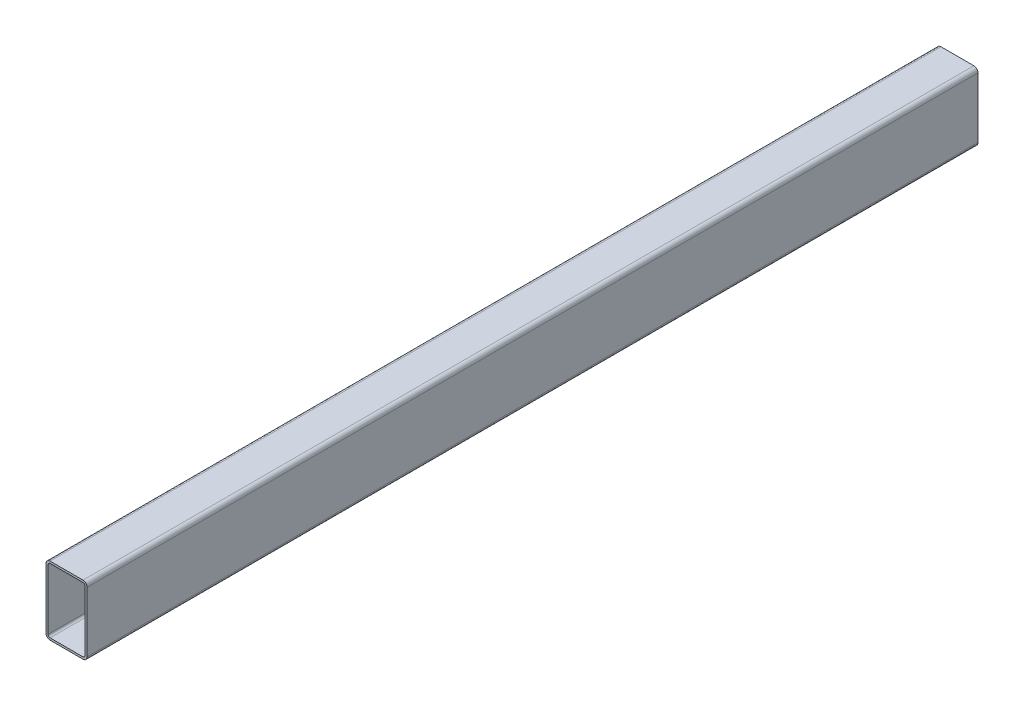
ISO-10303-21;
HEADER;
FILE_DESCRIPTION(('STEP AP214'),'2;1');
FILE_NAME('part.step','',(''),(''),'','','');
FILE_SCHEMA(('AUTOMOTIVE_DESIGN { 1 0 10303 214 1 1 1 1 }'));
ENDSEC;
DATA;
#1=APPLICATION_CONTEXT('core data for automotive mechanical design processes');
#2=APPLICATION_PROTOCOL_DEFINITION('international standard','automotive_design',2000,#1);
#3=PRODUCT_CONTEXT('',#1,'mechanical');
#4=PRODUCT('Part','Part','',(#3));
#5=PRODUCT_RELATED_PRODUCT_CATEGORY('part','',(#4));
#6=PRODUCT_DEFINITION_FORMATION('','',#4);
#7=PRODUCT_DEFINITION_CONTEXT('part definition',#1,'design');
#8=PRODUCT_DEFINITION('design','',#6,#7);
#9=PRODUCT_DEFINITION_SHAPE('','',#8);
#10=(LENGTH_UNIT() NAMED_UNIT(*) SI_UNIT(.MILLI.,.METRE.));
#11=(NAMED_UNIT(*) PLANE_ANGLE_UNIT() SI_UNIT($,.RADIAN.));
#12=(NAMED_UNIT(*) SI_UNIT($,.STERADIAN.) SOLID_ANGLE_UNIT());
#13=UNCERTAINTY_MEASURE_WITH_UNIT(LENGTH_MEASURE(1.E-05),#10,'distance_accuracy_value','');
#14=(GEOMETRIC_REPRESENTATION_CONTEXT(3) GLOBAL_UNCERTAINTY_ASSIGNED_CONTEXT((#13)) GLOBAL_UNIT_ASSIGNED_CONTEXT((#10,
#11,#12)) REPRESENTATION_CONTEXT('',''));
#15=CARTESIAN_POINT('',(0.,0.,0.));
#16=DIRECTION('',(0.,0.,1.));
#17=DIRECTION('',(1.,0.,0.));
#18=AXIS2_PLACEMENT_3D('',#15,#16,#17);
#19=CARTESIAN_POINT('',(-24.,-44.,650.));
#20=DIRECTION('',(0.,0.,-1.));
#21=DIRECTION('',(-1.,0.,0.));
#22=AXIS2_PLACEMENT_3D('',#19,#20,#21);
#23=PLANE('',#22);
#24=CARTESIAN_POINT('',(-24.,-44.,650.));
#25=DIRECTION('',(0.,0.,1.));
#26=DIRECTION('',(-1.,0.,0.));
#27=AXIS2_PLACEMENT_3D('',#24,#25,#26);
#28=CIRCLE('',#27,6.);
#29=CARTESIAN_POINT('',(-30.,-44.,650.));
#30=VERTEX_POINT('',#29);
#31=CARTESIAN_POINT('',(-24.,-50.,650.));
#32=VERTEX_POINT('',#31);
#33=EDGE_CURVE('E210',#30,#32,#28,.T.);
#34=ORIENTED_EDGE('',*,*,#33,.T.);
#35=DIRECTION('',(1.,0.,0.));
#36=VECTOR('',#35,1.);
#37=CARTESIAN_POINT('',(-24.,-50.,650.));
#38=LINE('',#37,#36);
#39=CARTESIAN_POINT('',(24.,-50.,650.));
#40=VERTEX_POINT('',#39);
#41=EDGE_CURVE('E213',#32,#40,#38,.T.);
#42=ORIENTED_EDGE('',*,*,#41,.T.);
#43=CARTESIAN_POINT('',(24.,-44.,650.));
#44=DIRECTION('',(0.,0.,1.));
#45=DIRECTION('',(1.,0.,0.));
#46=AXIS2_PLACEMENT_3D('',#43,#44,#45);
#47=CIRCLE('',#46,6.);
#48=CARTESIAN_POINT('',(30.,-44.,650.));
#49=VERTEX_POINT('',#48);
#50=EDGE_CURVE('E216',#40,#49,#47,.T.);
#51=ORIENTED_EDGE('',*,*,#50,.T.);
#52=DIRECTION('',(0.,1.,0.));
#53=VECTOR('',#52,1.);
#54=CARTESIAN_POINT('',(30.,-44.,650.));
#55=LINE('',#54,#53);
#56=CARTESIAN_POINT('',(30.,44.,650.));
#57=VERTEX_POINT('',#56);
#58=EDGE_CURVE('E218',#49,#57,#55,.T.);
#59=ORIENTED_EDGE('',*,*,#58,.T.);
#60=CARTESIAN_POINT('',(24.,44.,650.));
#61=DIRECTION('',(0.,0.,1.));
#62=DIRECTION('',(-1.,0.,0.));
#63=AXIS2_PLACEMENT_3D('',#60,#61,#62);
#64=CIRCLE('',#63,6.);
#65=CARTESIAN_POINT('',(24.,50.,650.));
#66=VERTEX_POINT('',#65);
#67=EDGE_CURVE('E220',#57,#66,#64,.T.);
#68=ORIENTED_EDGE('',*,*,#67,.T.);
#69=DIRECTION('',(-1.,0.,0.));
#70=VECTOR('',#69,1.);
#71=CARTESIAN_POINT('',(-24.,50.,650.));
#72=LINE('',#71,#70);
#73=CARTESIAN_POINT('',(-24.,50.,650.));
#74=VERTEX_POINT('',#73);
#75=EDGE_CURVE('E222',#66,#74,#72,.T.);
#76=ORIENTED_EDGE('',*,*,#75,.T.);
#77=CARTESIAN_POINT('',(-24.,44.,650.));
#78=DIRECTION('',(0.,0.,1.));
#79=DIRECTION('',(-1.,0.,0.));
#80=AXIS2_PLACEMENT_3D('',#77,#78,#79);
#81=CIRCLE('',#80,6.);
#82=CARTESIAN_POINT('',(-30.,44.,650.));
#83=VERTEX_POINT('',#82);
#84=EDGE_CURVE('E224',#74,#83,#81,.T.);
#85=ORIENTED_EDGE('',*,*,#84,.T.);
#86=DIRECTION('',(0.,-1.,0.));
#87=VECTOR('',#86,1.);
#88=CARTESIAN_POINT('',(-30.,-44.,650.));
#89=LINE('',#88,#87);
#90=EDGE_CURVE('E226',#83,#30,#89,.T.);
#91=ORIENTED_EDGE('',*,*,#90,.T.);
#92=EDGE_LOOP('',(#34,#42,#51,#59,#68,#76,#85,#91));
#93=FACE_BOUND('',#92,.T.);
#94=CARTESIAN_POINT('',(-24.,44.,650.));
#95=DIRECTION('',(0.,0.,1.));
#96=DIRECTION('',(-1.,0.,0.));
#97=AXIS2_PLACEMENT_3D('',#94,#95,#96);
#98=CIRCLE('',#97,3.);
#99=CARTESIAN_POINT('',(-24.,47.,650.));
#100=VERTEX_POINT('',#99);
#101=CARTESIAN_POINT('',(-27.,44.,650.));
#102=VERTEX_POINT('',#101);
#103=EDGE_CURVE('E145',#100,#102,#98,.T.);
#104=ORIENTED_EDGE('',*,*,#103,.F.);
#105=DIRECTION('',(-1.,0.,0.));
#106=VECTOR('',#105,1.);
#107=CARTESIAN_POINT('',(-24.,47.,650.));
#108=LINE('',#107,#106);
#109=CARTESIAN_POINT('',(24.,47.,650.));
#110=VERTEX_POINT('',#109);
#111=EDGE_CURVE('E178',#110,#100,#108,.T.);
#112=ORIENTED_EDGE('',*,*,#111,.F.);
#113=CARTESIAN_POINT('',(24.,44.,650.));
#114=DIRECTION('',(0.,0.,1.));
#115=DIRECTION('',(-1.,0.,0.));
#116=AXIS2_PLACEMENT_3D('',#113,#114,#115);
#117=CIRCLE('',#116,3.);
#118=CARTESIAN_POINT('',(27.,44.,650.));
#119=VERTEX_POINT('',#118);
#120=EDGE_CURVE('E176',#119,#110,#117,.T.);
#121=ORIENTED_EDGE('',*,*,#120,.F.);
#122=DIRECTION('',(0.,1.,0.));
#123=VECTOR('',#122,1.);
#124=CARTESIAN_POINT('',(27.,-44.,650.));
#125=LINE('',#124,#123);
#126=CARTESIAN_POINT('',(27.,-44.,650.));
#127=VERTEX_POINT('',#126);
#128=EDGE_CURVE('E174',#127,#119,#125,.T.);
#129=ORIENTED_EDGE('',*,*,#128,.F.);
#130=CARTESIAN_POINT('',(24.,-44.,650.));
#131=DIRECTION('',(0.,0.,1.));
#132=DIRECTION('',(1.,0.,0.));
#133=AXIS2_PLACEMENT_3D('',#130,#131,#132);
#134=CIRCLE('',#133,3.);
#135=CARTESIAN_POINT('',(24.,-47.,650.));
#136=VERTEX_POINT('',#135);
#137=EDGE_CURVE('E172',#136,#127,#134,.T.);
#138=ORIENTED_EDGE('',*,*,#137,.F.);
#139=DIRECTION('',(1.,0.,0.));
#140=VECTOR('',#139,1.);
#141=CARTESIAN_POINT('',(-24.,-47.,650.));
#142=LINE('',#141,#140);
#143=CARTESIAN_POINT('',(-24.,-47.,650.));
#144=VERTEX_POINT('',#143);
#145=EDGE_CURVE('E168',#144,#136,#142,.T.);
#146=ORIENTED_EDGE('',*,*,#145,.F.);
#147=CARTESIAN_POINT('',(-24.,-44.,650.));
#148=DIRECTION('',(0.,0.,1.));
#149=DIRECTION('',(-1.,0.,0.));
#150=AXIS2_PLACEMENT_3D('',#147,#148,#149);
#151=CIRCLE('',#150,3.);
#152=CARTESIAN_POINT('',(-27.,-44.,650.));
#153=VERTEX_POINT('',#152);
#154=EDGE_CURVE('E166',#153,#144,#151,.T.);
#155=ORIENTED_EDGE('',*,*,#154,.F.);
#156=DIRECTION('',(0.,-1.,0.));
#157=VECTOR('',#156,1.);
#158=CARTESIAN_POINT('',(-27.,-44.,650.));
#159=LINE('',#158,#157);
#160=EDGE_CURVE('E153',#102,#153,#159,.T.);
#161=ORIENTED_EDGE('',*,*,#160,.F.);
#162=EDGE_LOOP('',(#104,#112,#121,#129,#138,#146,#155,#161));
#163=FACE_BOUND('',#162,.T.);
#164=ADVANCED_FACE('F32',(#93,#163),#23,.F.);
#165=CARTESIAN_POINT('',(-24.,-44.,-650.));
#166=DIRECTION('',(0.,0.,-1.));
#167=DIRECTION('',(-1.,0.,0.));
#168=AXIS2_PLACEMENT_3D('',#165,#166,#167);
#169=PLANE('',#168);
#170=CARTESIAN_POINT('',(-24.,-44.,-650.));
#171=DIRECTION('',(0.,0.,1.));
#172=DIRECTION('',(-1.,0.,0.));
#173=AXIS2_PLACEMENT_3D('',#170,#171,#172);
#174=CIRCLE('',#173,6.);
#175=CARTESIAN_POINT('',(-30.,-44.,-650.));
#176=VERTEX_POINT('',#175);
#177=CARTESIAN_POINT('',(-24.,-50.,-650.));
#178=VERTEX_POINT('',#177);
#179=EDGE_CURVE('E161',#176,#178,#174,.T.);
#180=ORIENTED_EDGE('',*,*,#179,.F.);
#181=DIRECTION('',(0.,-1.,0.));
#182=VECTOR('',#181,1.);
#183=CARTESIAN_POINT('',(-30.,-44.,-650.));
#184=LINE('',#183,#182);
#185=CARTESIAN_POINT('',(-30.,44.,-650.));
#186=VERTEX_POINT('',#185);
#187=EDGE_CURVE('E214',#186,#176,#184,.T.);
#188=ORIENTED_EDGE('',*,*,#187,.F.);
#189=CARTESIAN_POINT('',(-24.,44.,-650.));
#190=DIRECTION('',(0.,0.,1.));
#191=DIRECTION('',(-1.,0.,0.));
#192=AXIS2_PLACEMENT_3D('',#189,#190,#191);
#193=CIRCLE('',#192,6.);
#194=CARTESIAN_POINT('',(-24.,50.,-650.));
#195=VERTEX_POINT('',#194);
#196=EDGE_CURVE('E241',#195,#186,#193,.T.);
#197=ORIENTED_EDGE('',*,*,#196,.F.);
#198=DIRECTION('',(-1.,0.,0.));
#199=VECTOR('',#198,1.);
#200=CARTESIAN_POINT('',(-24.,50.,-650.));
#201=LINE('',#200,#199);
#202=CARTESIAN_POINT('',(24.,50.,-650.));
#203=VERTEX_POINT('',#202);
#204=EDGE_CURVE('E239',#203,#195,#201,.T.);
#205=ORIENTED_EDGE('',*,*,#204,.F.);
#206=CARTESIAN_POINT('',(24.,44.,-650.));
#207=DIRECTION('',(0.,0.,1.));
#208=DIRECTION('',(-1.,0.,0.));
#209=AXIS2_PLACEMENT_3D('',#206,#207,#208);
#210=CIRCLE('',#209,6.);
#211=CARTESIAN_POINT('',(30.,44.,-650.));
#212=VERTEX_POINT('',#211);
#213=EDGE_CURVE('E237',#212,#203,#210,.T.);
#214=ORIENTED_EDGE('',*,*,#213,.F.);
#215=DIRECTION('',(0.,1.,0.));
#216=VECTOR('',#215,1.);
#217=CARTESIAN_POINT('',(30.,-44.,-650.));
#218=LINE('',#217,#216);
#219=CARTESIAN_POINT('',(30.,-44.,-650.));
#220=VERTEX_POINT('',#219);
#221=EDGE_CURVE('E235',#220,#212,#218,.T.);
#222=ORIENTED_EDGE('',*,*,#221,.F.);
#223=CARTESIAN_POINT('',(24.,-44.,-650.));
#224=DIRECTION('',(0.,0.,1.));
#225=DIRECTION('',(1.,0.,0.));
#226=AXIS2_PLACEMENT_3D('',#223,#224,#225);
#227=CIRCLE('',#226,6.);
#228=CARTESIAN_POINT('',(24.,-50.,-650.));
#229=VERTEX_POINT('',#228);
#230=EDGE_CURVE('E233',#229,#220,#227,.T.);
#231=ORIENTED_EDGE('',*,*,#230,.F.);
#232=DIRECTION('',(1.,0.,0.));
#233=VECTOR('',#232,1.);
#234=CARTESIAN_POINT('',(-24.,-50.,-650.));
#235=LINE('',#234,#233);
#236=EDGE_CURVE('E231',#178,#229,#235,.T.);
#237=ORIENTED_EDGE('',*,*,#236,.F.);
#238=EDGE_LOOP('',(#180,#188,#197,#205,#214,#222,#231,#237));
#239=FACE_BOUND('',#238,.T.);
#240=DIRECTION('',(-1.,0.,0.));
#241=VECTOR('',#240,1.);
#242=CARTESIAN_POINT('',(-24.,47.,-650.));
#243=LINE('',#242,#241);
#244=CARTESIAN_POINT('',(24.,47.,-650.));
#245=VERTEX_POINT('',#244);
#246=CARTESIAN_POINT('',(-24.,47.,-650.));
#247=VERTEX_POINT('',#246);
#248=EDGE_CURVE('E154',#245,#247,#243,.T.);
#249=ORIENTED_EDGE('',*,*,#248,.T.);
#250=CARTESIAN_POINT('',(-24.,44.,-650.));
#251=DIRECTION('',(0.,0.,1.));
#252=DIRECTION('',(-1.,0.,0.));
#253=AXIS2_PLACEMENT_3D('',#250,#251,#252);
#254=CIRCLE('',#253,3.);
#255=CARTESIAN_POINT('',(-27.,44.,-650.));
#256=VERTEX_POINT('',#255);
#257=EDGE_CURVE('E55',#247,#256,#254,.T.);
#258=ORIENTED_EDGE('',*,*,#257,.T.);
#259=DIRECTION('',(0.,-1.,0.));
#260=VECTOR('',#259,1.);
#261=CARTESIAN_POINT('',(-27.,-44.,-650.));
#262=LINE('',#261,#260);
#263=CARTESIAN_POINT('',(-27.,-44.,-650.));
#264=VERTEX_POINT('',#263);
#265=EDGE_CURVE('E160',#256,#264,#262,.T.);
#266=ORIENTED_EDGE('',*,*,#265,.T.);
#267=CARTESIAN_POINT('',(-24.,-44.,-650.));
#268=DIRECTION('',(0.,0.,1.));
#269=DIRECTION('',(-1.,0.,0.));
#270=AXIS2_PLACEMENT_3D('',#267,#268,#269);
#271=CIRCLE('',#270,3.);
#272=CARTESIAN_POINT('',(-24.,-47.,-650.));
#273=VERTEX_POINT('',#272);
#274=EDGE_CURVE('E182',#264,#273,#271,.T.);
#275=ORIENTED_EDGE('',*,*,#274,.T.);
#276=DIRECTION('',(1.,0.,0.));
#277=VECTOR('',#276,1.);
#278=CARTESIAN_POINT('',(-24.,-47.,-650.));
#279=LINE('',#278,#277);
#280=CARTESIAN_POINT('',(24.,-47.,-650.));
#281=VERTEX_POINT('',#280);
#282=EDGE_CURVE('E185',#273,#281,#279,.T.);
#283=ORIENTED_EDGE('',*,*,#282,.T.);
#284=CARTESIAN_POINT('',(24.,-44.,-650.));
#285=DIRECTION('',(0.,0.,1.));
#286=DIRECTION('',(1.,0.,0.));
#287=AXIS2_PLACEMENT_3D('',#284,#285,#286);
#288=CIRCLE('',#287,3.);
#289=CARTESIAN_POINT('',(27.,-44.,-650.));
#290=VERTEX_POINT('',#289);
#291=EDGE_CURVE('E188',#281,#290,#288,.T.);
#292=ORIENTED_EDGE('',*,*,#291,.T.);
#293=DIRECTION('',(0.,1.,0.));
#294=VECTOR('',#293,1.);
#295=CARTESIAN_POINT('',(27.,-44.,-650.));
#296=LINE('',#295,#294);
#297=CARTESIAN_POINT('',(27.,44.,-650.));
#298=VERTEX_POINT('',#297);
#299=EDGE_CURVE('E191',#290,#298,#296,.T.);
#300=ORIENTED_EDGE('',*,*,#299,.T.);
#301=CARTESIAN_POINT('',(24.,44.,-650.));
#302=DIRECTION('',(0.,0.,1.));
#303=DIRECTION('',(-1.,0.,0.));
#304=AXIS2_PLACEMENT_3D('',#301,#302,#303);
#305=CIRCLE('',#304,3.);
#306=EDGE_CURVE('E194',#298,#245,#305,.T.);
#307=ORIENTED_EDGE('',*,*,#306,.T.);
#308=EDGE_LOOP('',(#249,#258,#266,#275,#283,#292,#300,#307));
#309=FACE_BOUND('',#308,.T.);
#310=ADVANCED_FACE('F271',(#239,#309),#169,.T.);
#311=CARTESIAN_POINT('',(-24.,-44.,650.));
#312=DIRECTION('',(0.,0.,-1.));
#313=DIRECTION('',(-1.,0.,0.));
#314=AXIS2_PLACEMENT_3D('',#311,#312,#313);
#315=CYLINDRICAL_SURFACE('',#314,6.);
#316=ORIENTED_EDGE('',*,*,#179,.T.);
#317=DIRECTION('',(0.,0.,-1.));
#318=VECTOR('',#317,1.);
#319=CARTESIAN_POINT('',(-24.,-50.,650.));
#320=LINE('',#319,#318);
#321=EDGE_CURVE('E11',#32,#178,#320,.T.);
#322=ORIENTED_EDGE('',*,*,#321,.F.);
#323=ORIENTED_EDGE('',*,*,#33,.F.);
#324=DIRECTION('',(0.,0.,-1.));
#325=VECTOR('',#324,1.);
#326=CARTESIAN_POINT('',(-30.,-44.,650.));
#327=LINE('',#326,#325);
#328=EDGE_CURVE('E228',#30,#176,#327,.T.);
#329=ORIENTED_EDGE('',*,*,#328,.T.);
#330=EDGE_LOOP('',(#316,#322,#323,#329));
#331=FACE_BOUND('',#330,.T.);
#332=ADVANCED_FACE('F34',(#331),#315,.T.);
#333=CARTESIAN_POINT('',(-24.,-50.,650.));
#334=DIRECTION('',(0.,1.,0.));
#335=DIRECTION('',(0.,0.,1.));
#336=AXIS2_PLACEMENT_3D('',#333,#334,#335);
#337=PLANE('',#336);
#338=ORIENTED_EDGE('',*,*,#236,.T.);
#339=DIRECTION('',(0.,0.,-1.));
#340=VECTOR('',#339,1.);
#341=CARTESIAN_POINT('',(24.,-50.,650.));
#342=LINE('',#341,#340);
#343=EDGE_CURVE('E40',#40,#229,#342,.T.);
#344=ORIENTED_EDGE('',*,*,#343,.F.);
#345=ORIENTED_EDGE('',*,*,#41,.F.);
#346=ORIENTED_EDGE('',*,*,#321,.T.);
#347=EDGE_LOOP('',(#338,#344,#345,#346));
#348=FACE_BOUND('',#347,.T.);
#349=ADVANCED_FACE('F288',(#348),#337,.F.);
#350=CARTESIAN_POINT('',(24.,-44.,650.));
#351=DIRECTION('',(0.,0.,-1.));
#352=DIRECTION('',(-1.,0.,0.));
#353=AXIS2_PLACEMENT_3D('',#350,#351,#352);
#354=CYLINDRICAL_SURFACE('',#353,6.);
#355=ORIENTED_EDGE('',*,*,#230,.T.);
#356=DIRECTION('',(0.,0.,-1.));
#357=VECTOR('',#356,1.);
#358=CARTESIAN_POINT('',(30.,-44.,650.));
#359=LINE('',#358,#357);
#360=EDGE_CURVE('E258',#49,#220,#359,.T.);
#361=ORIENTED_EDGE('',*,*,#360,.F.);
#362=ORIENTED_EDGE('',*,*,#50,.F.);
#363=ORIENTED_EDGE('',*,*,#343,.T.);
#364=EDGE_LOOP('',(#355,#361,#362,#363));
#365=FACE_BOUND('',#364,.T.);
#366=ADVANCED_FACE('F265',(#365),#354,.T.);
#367=CARTESIAN_POINT('',(30.,-44.,650.));
#368=DIRECTION('',(-1.,0.,0.));
#369=DIRECTION('',(0.,0.,1.));
#370=AXIS2_PLACEMENT_3D('',#367,#368,#369);
#371=PLANE('',#370);
#372=ORIENTED_EDGE('',*,*,#221,.T.);
#373=DIRECTION('',(0.,0.,-1.));
#374=VECTOR('',#373,1.);
#375=CARTESIAN_POINT('',(30.,44.,650.));
#376=LINE('',#375,#374);
#377=EDGE_CURVE('E255',#57,#212,#376,.T.);
#378=ORIENTED_EDGE('',*,*,#377,.F.);
#379=ORIENTED_EDGE('',*,*,#58,.F.);
#380=ORIENTED_EDGE('',*,*,#360,.T.);
#381=EDGE_LOOP('',(#372,#378,#379,#380));
#382=FACE_BOUND('',#381,.T.);
#383=ADVANCED_FACE('F277',(#382),#371,.F.);
#384=CARTESIAN_POINT('',(24.,44.,650.));
#385=DIRECTION('',(0.,0.,-1.));
#386=DIRECTION('',(-1.,0.,0.));
#387=AXIS2_PLACEMENT_3D('',#384,#385,#386);
#388=CYLINDRICAL_SURFACE('',#387,6.);
#389=ORIENTED_EDGE('',*,*,#213,.T.);
#390=DIRECTION('',(0.,0.,-1.));
#391=VECTOR('',#390,1.);
#392=CARTESIAN_POINT('',(24.,50.,650.));
#393=LINE('',#392,#391);
#394=EDGE_CURVE('E252',#66,#203,#393,.T.);
#395=ORIENTED_EDGE('',*,*,#394,.F.);
#396=ORIENTED_EDGE('',*,*,#67,.F.);
#397=ORIENTED_EDGE('',*,*,#377,.T.);
#398=EDGE_LOOP('',(#389,#395,#396,#397));
#399=FACE_BOUND('',#398,.T.);
#400=ADVANCED_FACE('F281',(#399),#388,.T.);
#401=CARTESIAN_POINT('',(-24.,50.,650.));
#402=DIRECTION('',(0.,-1.,0.));
#403=DIRECTION('',(0.,0.,-1.));
#404=AXIS2_PLACEMENT_3D('',#401,#402,#403);
#405=PLANE('',#404);
#406=ORIENTED_EDGE('',*,*,#204,.T.);
#407=DIRECTION('',(0.,0.,-1.));
#408=VECTOR('',#407,1.);
#409=CARTESIAN_POINT('',(-24.,50.,650.));
#410=LINE('',#409,#408);
#411=EDGE_CURVE('E249',#74,#195,#410,.T.);
#412=ORIENTED_EDGE('',*,*,#411,.F.);
#413=ORIENTED_EDGE('',*,*,#75,.F.);
#414=ORIENTED_EDGE('',*,*,#394,.T.);
#415=EDGE_LOOP('',(#406,#412,#413,#414));
#416=FACE_BOUND('',#415,.T.);
#417=ADVANCED_FACE('F301',(#416),#405,.F.);
#418=CARTESIAN_POINT('',(-24.,44.,650.));
#419=DIRECTION('',(0.,0.,-1.));
#420=DIRECTION('',(-1.,0.,0.));
#421=AXIS2_PLACEMENT_3D('',#418,#419,#420);
#422=CYLINDRICAL_SURFACE('',#421,6.);
#423=ORIENTED_EDGE('',*,*,#196,.T.);
#424=DIRECTION('',(0.,0.,-1.));
#425=VECTOR('',#424,1.);
#426=CARTESIAN_POINT('',(-30.,44.,650.));
#427=LINE('',#426,#425);
#428=EDGE_CURVE('E246',#83,#186,#427,.T.);
#429=ORIENTED_EDGE('',*,*,#428,.F.);
#430=ORIENTED_EDGE('',*,*,#84,.F.);
#431=ORIENTED_EDGE('',*,*,#411,.T.);
#432=EDGE_LOOP('',(#423,#429,#430,#431));
#433=FACE_BOUND('',#432,.T.);
#434=ADVANCED_FACE('F299',(#433),#422,.T.);
#435=CARTESIAN_POINT('',(-30.,-44.,650.));
#436=DIRECTION('',(1.,0.,0.));
#437=DIRECTION('',(0.,0.,-1.));
#438=AXIS2_PLACEMENT_3D('',#435,#436,#437);
#439=PLANE('',#438);
#440=ORIENTED_EDGE('',*,*,#187,.T.);
#441=ORIENTED_EDGE('',*,*,#328,.F.);
#442=ORIENTED_EDGE('',*,*,#90,.F.);
#443=ORIENTED_EDGE('',*,*,#428,.T.);
#444=EDGE_LOOP('',(#440,#441,#442,#443));
#445=FACE_BOUND('',#444,.T.);
#446=ADVANCED_FACE('F294',(#445),#439,.F.);
#447=CARTESIAN_POINT('',(-24.,44.,650.));
#448=DIRECTION('',(0.,0.,-1.));
#449=DIRECTION('',(-1.,0.,0.));
#450=AXIS2_PLACEMENT_3D('',#447,#448,#449);
#451=CYLINDRICAL_SURFACE('',#450,3.);
#452=ORIENTED_EDGE('',*,*,#257,.F.);
#453=DIRECTION('',(0.,0.,-1.));
#454=VECTOR('',#453,1.);
#455=CARTESIAN_POINT('',(-24.,47.,650.));
#456=LINE('',#455,#454);
#457=EDGE_CURVE('E149',#100,#247,#456,.T.);
#458=ORIENTED_EDGE('',*,*,#457,.F.);
#459=ORIENTED_EDGE('',*,*,#103,.T.);
#460=DIRECTION('',(0.,0.,-1.));
#461=VECTOR('',#460,1.);
#462=CARTESIAN_POINT('',(-27.,44.,650.));
#463=LINE('',#462,#461);
#464=EDGE_CURVE('E148',#102,#256,#463,.T.);
#465=ORIENTED_EDGE('',*,*,#464,.T.);
#466=EDGE_LOOP('',(#452,#458,#459,#465));
#467=FACE_BOUND('',#466,.T.);
#468=ADVANCED_FACE('F147',(#467),#451,.F.);
#469=CARTESIAN_POINT('',(-27.,-44.,650.));
#470=DIRECTION('',(1.,0.,0.));
#471=DIRECTION('',(0.,1.,0.));
#472=AXIS2_PLACEMENT_3D('',#469,#470,#471);
#473=PLANE('',#472);
#474=ORIENTED_EDGE('',*,*,#265,.F.);
#475=ORIENTED_EDGE('',*,*,#464,.F.);
#476=ORIENTED_EDGE('',*,*,#160,.T.);
#477=DIRECTION('',(0.,0.,-1.));
#478=VECTOR('',#477,1.);
#479=CARTESIAN_POINT('',(-27.,-44.,650.));
#480=LINE('',#479,#478);
#481=EDGE_CURVE('E162',#153,#264,#480,.T.);
#482=ORIENTED_EDGE('',*,*,#481,.T.);
#483=EDGE_LOOP('',(#474,#475,#476,#482));
#484=FACE_BOUND('',#483,.T.);
#485=ADVANCED_FACE('F157',(#484),#473,.T.);
#486=CARTESIAN_POINT('',(-24.,-44.,650.));
#487=DIRECTION('',(0.,0.,-1.));
#488=DIRECTION('',(-1.,0.,0.));
#489=AXIS2_PLACEMENT_3D('',#486,#487,#488);
#490=CYLINDRICAL_SURFACE('',#489,3.);
#491=ORIENTED_EDGE('',*,*,#274,.F.);
#492=ORIENTED_EDGE('',*,*,#481,.F.);
#493=ORIENTED_EDGE('',*,*,#154,.T.);
#494=DIRECTION('',(0.,0.,-1.));
#495=VECTOR('',#494,1.);
#496=CARTESIAN_POINT('',(-24.,-47.,650.));
#497=LINE('',#496,#495);
#498=EDGE_CURVE('E207',#144,#273,#497,.T.);
#499=ORIENTED_EDGE('',*,*,#498,.T.);
#500=EDGE_LOOP('',(#491,#492,#493,#499));
#501=FACE_BOUND('',#500,.T.);
#502=ADVANCED_FACE('F326',(#501),#490,.F.);
#503=CARTESIAN_POINT('',(-24.,-47.,650.));
#504=DIRECTION('',(0.,1.,0.));
#505=DIRECTION('',(-1.,0.,0.));
#506=AXIS2_PLACEMENT_3D('',#503,#504,#505);
#507=PLANE('',#506);
#508=ORIENTED_EDGE('',*,*,#282,.F.);
#509=ORIENTED_EDGE('',*,*,#498,.F.);
#510=ORIENTED_EDGE('',*,*,#145,.T.);
#511=DIRECTION('',(0.,0.,-1.));
#512=VECTOR('',#511,1.);
#513=CARTESIAN_POINT('',(24.,-47.,650.));
#514=LINE('',#513,#512);
#515=EDGE_CURVE('E205',#136,#281,#514,.T.);
#516=ORIENTED_EDGE('',*,*,#515,.T.);
#517=EDGE_LOOP('',(#508,#509,#510,#516));
#518=FACE_BOUND('',#517,.T.);
#519=ADVANCED_FACE('F330',(#518),#507,.T.);
#520=CARTESIAN_POINT('',(24.,-44.,650.));
#521=DIRECTION('',(0.,0.,-1.));
#522=DIRECTION('',(-1.,0.,0.));
#523=AXIS2_PLACEMENT_3D('',#520,#521,#522);
#524=CYLINDRICAL_SURFACE('',#523,3.);
#525=ORIENTED_EDGE('',*,*,#291,.F.);
#526=ORIENTED_EDGE('',*,*,#515,.F.);
#527=ORIENTED_EDGE('',*,*,#137,.T.);
#528=DIRECTION('',(0.,0.,-1.));
#529=VECTOR('',#528,1.);
#530=CARTESIAN_POINT('',(27.,-44.,650.));
#531=LINE('',#530,#529);
#532=EDGE_CURVE('E203',#127,#290,#531,.T.);
#533=ORIENTED_EDGE('',*,*,#532,.T.);
#534=EDGE_LOOP('',(#525,#526,#527,#533));
#535=FACE_BOUND('',#534,.T.);
#536=ADVANCED_FACE('F336',(#535),#524,.F.);
#537=CARTESIAN_POINT('',(27.,-44.,650.));
#538=DIRECTION('',(-1.,0.,0.));
#539=DIRECTION('',(0.,-1.,0.));
#540=AXIS2_PLACEMENT_3D('',#537,#538,#539);
#541=PLANE('',#540);
#542=ORIENTED_EDGE('',*,*,#299,.F.);
#543=ORIENTED_EDGE('',*,*,#532,.F.);
#544=ORIENTED_EDGE('',*,*,#128,.T.);
#545=DIRECTION('',(0.,0.,-1.));
#546=VECTOR('',#545,1.);
#547=CARTESIAN_POINT('',(27.,44.,650.));
#548=LINE('',#547,#546);
#549=EDGE_CURVE('E201',#119,#298,#548,.T.);
#550=ORIENTED_EDGE('',*,*,#549,.T.);
#551=EDGE_LOOP('',(#542,#543,#544,#550));
#552=FACE_BOUND('',#551,.T.);
#553=ADVANCED_FACE('F340',(#552),#541,.T.);
#554=CARTESIAN_POINT('',(24.,44.,650.));
#555=DIRECTION('',(0.,0.,-1.));
#556=DIRECTION('',(-1.,0.,0.));
#557=AXIS2_PLACEMENT_3D('',#554,#555,#556);
#558=CYLINDRICAL_SURFACE('',#557,3.);
#559=ORIENTED_EDGE('',*,*,#306,.F.);
#560=ORIENTED_EDGE('',*,*,#549,.F.);
#561=ORIENTED_EDGE('',*,*,#120,.T.);
#562=DIRECTION('',(0.,0.,-1.));
#563=VECTOR('',#562,1.);
#564=CARTESIAN_POINT('',(24.,47.,650.));
#565=LINE('',#564,#563);
#566=EDGE_CURVE('E47',#110,#245,#565,.T.);
#567=ORIENTED_EDGE('',*,*,#566,.T.);
#568=EDGE_LOOP('',(#559,#560,#561,#567));
#569=FACE_BOUND('',#568,.T.);
#570=ADVANCED_FACE('F344',(#569),#558,.F.);
#571=CARTESIAN_POINT('',(-24.,47.,650.));
#572=DIRECTION('',(0.,-1.,0.));
#573=DIRECTION('',(0.,0.,-1.));
#574=AXIS2_PLACEMENT_3D('',#571,#572,#573);
#575=PLANE('',#574);
#576=ORIENTED_EDGE('',*,*,#248,.F.);
#577=ORIENTED_EDGE('',*,*,#566,.F.);
#578=ORIENTED_EDGE('',*,*,#111,.T.);
#579=ORIENTED_EDGE('',*,*,#457,.T.);
#580=EDGE_LOOP('',(#576,#577,#578,#579));
#581=FACE_BOUND('',#580,.T.);
#582=ADVANCED_FACE('F348',(#581),#575,.T.);
#583=CLOSED_SHELL('',(#164,#310,#332,#349,#366,#383,#400,#417,#434,#446,#468,#485,#502,#519,
#536,#553,#570,#582));
#584=MANIFOLD_SOLID_BREP('B2',#583);
#585=ADVANCED_BREP_SHAPE_REPRESENTATION('',(#18,#584),#14);
#586=SHAPE_DEFINITION_REPRESENTATION(#9,#585);
ENDSEC;
END-ISO-10303-21;
